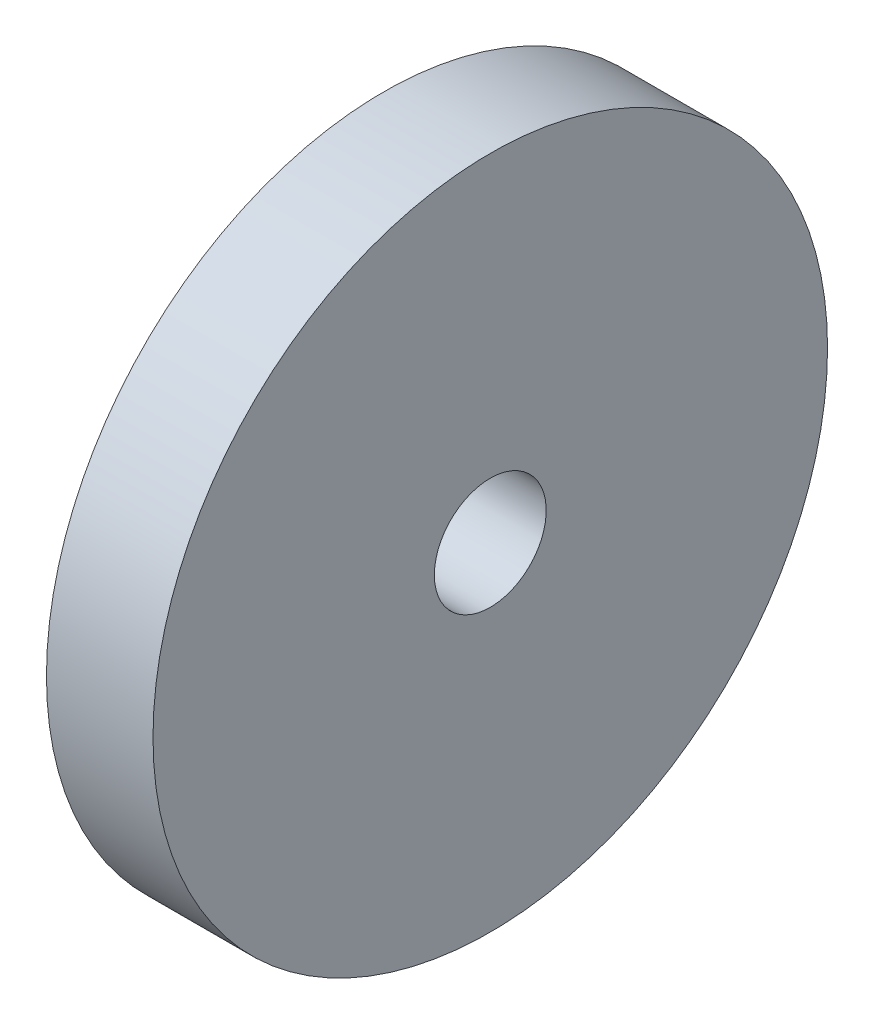
ISO-10303-21;
HEADER;
FILE_DESCRIPTION(('STEP AP214'),'2;1');
FILE_NAME('part.step','',(''),(''),'','','');
FILE_SCHEMA(('AUTOMOTIVE_DESIGN { 1 0 10303 214 1 1 1 1 }'));
ENDSEC;
DATA;
#1=APPLICATION_CONTEXT('core data for automotive mechanical design processes');
#2=APPLICATION_PROTOCOL_DEFINITION('international standard','automotive_design',2000,#1);
#3=PRODUCT_CONTEXT('',#1,'mechanical');
#4=PRODUCT('Part','Part','',(#3));
#5=PRODUCT_RELATED_PRODUCT_CATEGORY('part','',(#4));
#6=PRODUCT_DEFINITION_FORMATION('','',#4);
#7=PRODUCT_DEFINITION_CONTEXT('part definition',#1,'design');
#8=PRODUCT_DEFINITION('design','',#6,#7);
#9=PRODUCT_DEFINITION_SHAPE('','',#8);
#10=(LENGTH_UNIT() NAMED_UNIT(*) SI_UNIT(.MILLI.,.METRE.));
#11=(NAMED_UNIT(*) PLANE_ANGLE_UNIT() SI_UNIT($,.RADIAN.));
#12=(NAMED_UNIT(*) SI_UNIT($,.STERADIAN.) SOLID_ANGLE_UNIT());
#13=UNCERTAINTY_MEASURE_WITH_UNIT(LENGTH_MEASURE(1.E-05),#10,'distance_accuracy_value','');
#14=(GEOMETRIC_REPRESENTATION_CONTEXT(3) GLOBAL_UNCERTAINTY_ASSIGNED_CONTEXT((#13)) GLOBAL_UNIT_ASSIGNED_CONTEXT((#10,
#11,#12)) REPRESENTATION_CONTEXT('',''));
#15=CARTESIAN_POINT('',(0.,0.,0.));
#16=DIRECTION('',(0.,0.,1.));
#17=DIRECTION('',(1.,0.,0.));
#18=AXIS2_PLACEMENT_3D('',#15,#16,#17);
#19=CARTESIAN_POINT('',(-332.206594656609,32.815,-139.7));
#20=DIRECTION('',(-1.,0.,0.));
#21=DIRECTION('',(0.,0.,1.));
#22=AXIS2_PLACEMENT_3D('',#19,#20,#21);
#23=CYLINDRICAL_SURFACE('',#22,5.054);
#24=CARTESIAN_POINT('',(-305.112154144243,32.815,-139.7));
#25=DIRECTION('',(-1.,0.,0.));
#26=DIRECTION('',(0.,0.,1.));
#27=AXIS2_PLACEMENT_3D('',#24,#25,#26);
#28=CIRCLE('',#27,5.054);
#29=CARTESIAN_POINT('',(-305.112154144243,32.815,-134.646));
#30=VERTEX_POINT('',#29);
#31=EDGE_CURVE('E10',#30,#30,#28,.T.);
#32=ORIENTED_EDGE('',*,*,#31,.F.);
#33=EDGE_LOOP('',(#32));
#34=FACE_BOUND('',#33,.T.);
#35=CARTESIAN_POINT('',(-314.740941404825,32.815,-139.7));
#36=DIRECTION('',(-1.,0.,0.));
#37=DIRECTION('',(0.,0.,1.));
#38=AXIS2_PLACEMENT_3D('',#35,#36,#37);
#39=CIRCLE('',#38,5.054);
#40=CARTESIAN_POINT('',(-314.740941404825,32.815,-134.646));
#41=VERTEX_POINT('',#40);
#42=EDGE_CURVE('E45',#41,#41,#39,.T.);
#43=ORIENTED_EDGE('',*,*,#42,.T.);
#44=EDGE_LOOP('',(#43));
#45=FACE_BOUND('',#44,.T.);
#46=ADVANCED_FACE('F31',(#34,#45),#23,.F.);
#47=CARTESIAN_POINT('',(-305.112154144243,32.815,-144.754));
#48=DIRECTION('',(-1.,0.,0.));
#49=DIRECTION('',(0.,0.,1.));
#50=AXIS2_PLACEMENT_3D('',#47,#48,#49);
#51=PLANE('',#50);
#52=CARTESIAN_POINT('',(-305.112154144243,32.815,-139.7));
#53=DIRECTION('',(-1.,0.,0.));
#54=DIRECTION('',(0.,0.,1.));
#55=AXIS2_PLACEMENT_3D('',#52,#53,#54);
#56=CIRCLE('',#55,30.48);
#57=CARTESIAN_POINT('',(-305.112154144243,32.815,-109.22));
#58=VERTEX_POINT('',#57);
#59=EDGE_CURVE('E37',#58,#58,#56,.T.);
#60=ORIENTED_EDGE('',*,*,#59,.F.);
#61=EDGE_LOOP('',(#60));
#62=FACE_BOUND('',#61,.T.);
#63=ORIENTED_EDGE('',*,*,#31,.T.);
#64=EDGE_LOOP('',(#63));
#65=FACE_BOUND('',#64,.T.);
#66=ADVANCED_FACE('F60',(#62,#65),#51,.F.);
#67=CARTESIAN_POINT('',(-332.206594656609,32.815,-139.7));
#68=DIRECTION('',(-1.,0.,0.));
#69=DIRECTION('',(0.,0.,1.));
#70=AXIS2_PLACEMENT_3D('',#67,#68,#69);
#71=CYLINDRICAL_SURFACE('',#70,30.48);
#72=ORIENTED_EDGE('',*,*,#59,.T.);
#73=EDGE_LOOP('',(#72));
#74=FACE_BOUND('',#73,.T.);
#75=CARTESIAN_POINT('',(-314.740941404825,32.815,-139.7));
#76=DIRECTION('',(-1.,0.,0.));
#77=DIRECTION('',(0.,0.,1.));
#78=AXIS2_PLACEMENT_3D('',#75,#76,#77);
#79=CIRCLE('',#78,30.48);
#80=CARTESIAN_POINT('',(-314.740941404825,32.815,-109.22));
#81=VERTEX_POINT('',#80);
#82=EDGE_CURVE('E41',#81,#81,#79,.T.);
#83=ORIENTED_EDGE('',*,*,#82,.F.);
#84=EDGE_LOOP('',(#83));
#85=FACE_BOUND('',#84,.T.);
#86=ADVANCED_FACE('F54',(#74,#85),#71,.T.);
#87=CARTESIAN_POINT('',(-314.740941404825,32.815,-144.754));
#88=DIRECTION('',(-1.,0.,0.));
#89=DIRECTION('',(0.,0.,1.));
#90=AXIS2_PLACEMENT_3D('',#87,#88,#89);
#91=PLANE('',#90);
#92=ORIENTED_EDGE('',*,*,#82,.T.);
#93=EDGE_LOOP('',(#92));
#94=FACE_BOUND('',#93,.T.);
#95=ORIENTED_EDGE('',*,*,#42,.F.);
#96=EDGE_LOOP('',(#95));
#97=FACE_BOUND('',#96,.T.);
#98=ADVANCED_FACE('F52',(#94,#97),#91,.T.);
#99=CLOSED_SHELL('',(#46,#66,#86,#98));
#100=MANIFOLD_SOLID_BREP('B2',#99);
#101=ADVANCED_BREP_SHAPE_REPRESENTATION('',(#18,#100),#14);
#102=SHAPE_DEFINITION_REPRESENTATION(#9,#101);
ENDSEC;
END-ISO-10303-21;
